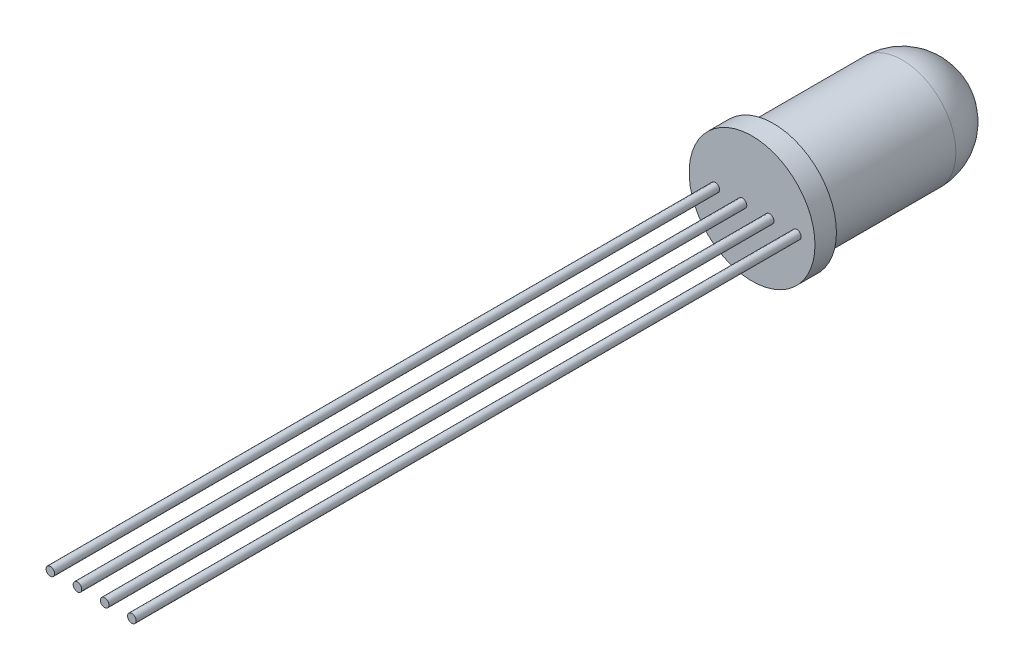
ISO-10303-21;
HEADER;
FILE_DESCRIPTION(('STEP AP214'),'2;1');
FILE_NAME('part.step','',(''),(''),'','','');
FILE_SCHEMA(('AUTOMOTIVE_DESIGN { 1 0 10303 214 1 1 1 1 }'));
ENDSEC;
DATA;
#1=APPLICATION_CONTEXT('core data for automotive mechanical design processes');
#2=APPLICATION_PROTOCOL_DEFINITION('international standard','automotive_design',2000,#1);
#3=PRODUCT_CONTEXT('',#1,'mechanical');
#4=PRODUCT('Part','Part','',(#3));
#5=PRODUCT_RELATED_PRODUCT_CATEGORY('part','',(#4));
#6=PRODUCT_DEFINITION_FORMATION('','',#4);
#7=PRODUCT_DEFINITION_CONTEXT('part definition',#1,'design');
#8=PRODUCT_DEFINITION('design','',#6,#7);
#9=PRODUCT_DEFINITION_SHAPE('','',#8);
#10=(LENGTH_UNIT() NAMED_UNIT(*) SI_UNIT(.MILLI.,.METRE.));
#11=(NAMED_UNIT(*) PLANE_ANGLE_UNIT() SI_UNIT($,.RADIAN.));
#12=(NAMED_UNIT(*) SI_UNIT($,.STERADIAN.) SOLID_ANGLE_UNIT());
#13=UNCERTAINTY_MEASURE_WITH_UNIT(LENGTH_MEASURE(1.E-05),#10,'distance_accuracy_value','');
#14=(GEOMETRIC_REPRESENTATION_CONTEXT(3) GLOBAL_UNCERTAINTY_ASSIGNED_CONTEXT((#13)) GLOBAL_UNIT_ASSIGNED_CONTEXT((#10,
#11,#12)) REPRESENTATION_CONTEXT('',''));
#15=CARTESIAN_POINT('',(0.,0.,0.));
#16=DIRECTION('',(0.,0.,1.));
#17=DIRECTION('',(1.,0.,0.));
#18=AXIS2_PLACEMENT_3D('',#15,#16,#17);
#19=CARTESIAN_POINT('',(0.,0.,8.5));
#20=DIRECTION('',(0.,0.,-1.));
#21=DIRECTION('',(-1.,0.,0.));
#22=AXIS2_PLACEMENT_3D('',#19,#20,#21);
#23=CYLINDRICAL_SURFACE('',#22,2.5);
#24=CARTESIAN_POINT('',(0.,0.,2.5));
#25=DIRECTION('',(0.,0.,-1.));
#26=DIRECTION('',(-1.,0.,0.));
#27=AXIS2_PLACEMENT_3D('',#24,#25,#26);
#28=CIRCLE('',#27,2.5);
#29=CARTESIAN_POINT('',(-2.5,0.,2.5));
#30=VERTEX_POINT('',#29);
#31=EDGE_CURVE('E10',#30,#30,#28,.F.);
#32=ORIENTED_EDGE('',*,*,#31,.T.);
#33=EDGE_LOOP('',(#32));
#34=FACE_BOUND('',#33,.T.);
#35=CARTESIAN_POINT('',(0.,0.,8.5));
#36=DIRECTION('',(0.,0.,1.));
#37=DIRECTION('',(1.,0.,0.));
#38=AXIS2_PLACEMENT_3D('',#35,#36,#37);
#39=CIRCLE('',#38,2.5);
#40=CARTESIAN_POINT('',(2.5,0.,8.5));
#41=VERTEX_POINT('',#40);
#42=EDGE_CURVE('E48',#41,#41,#39,.T.);
#43=ORIENTED_EDGE('',*,*,#42,.F.);
#44=EDGE_LOOP('',(#43));
#45=FACE_BOUND('',#44,.T.);
#46=ADVANCED_FACE('F41',(#34,#45),#23,.T.);
#47=CARTESIAN_POINT('',(0.,0.,9.5));
#48=DIRECTION('',(0.,0.,-1.));
#49=DIRECTION('',(-1.,0.,0.));
#50=AXIS2_PLACEMENT_3D('',#47,#48,#49);
#51=CYLINDRICAL_SURFACE('',#50,2.93297603406801);
#52=CARTESIAN_POINT('',(0.,0.,9.5));
#53=DIRECTION('',(0.,0.,1.));
#54=DIRECTION('',(1.,0.,0.));
#55=AXIS2_PLACEMENT_3D('',#52,#53,#54);
#56=CIRCLE('',#55,2.93297603406801);
#57=CARTESIAN_POINT('',(2.93297603406801,0.,9.5));
#58=VERTEX_POINT('',#57);
#59=EDGE_CURVE('E52',#58,#58,#56,.T.);
#60=ORIENTED_EDGE('',*,*,#59,.F.);
#61=EDGE_LOOP('',(#60));
#62=FACE_BOUND('',#61,.T.);
#63=CARTESIAN_POINT('',(0.,0.,8.5));
#64=DIRECTION('',(0.,0.,1.));
#65=DIRECTION('',(1.,0.,0.));
#66=AXIS2_PLACEMENT_3D('',#63,#64,#65);
#67=CIRCLE('',#66,2.93297603406801);
#68=CARTESIAN_POINT('',(2.93297603406801,0.,8.5));
#69=VERTEX_POINT('',#68);
#70=EDGE_CURVE('E56',#69,#69,#67,.T.);
#71=ORIENTED_EDGE('',*,*,#70,.T.);
#72=EDGE_LOOP('',(#71));
#73=FACE_BOUND('',#72,.T.);
#74=ADVANCED_FACE('F92',(#62,#73),#51,.T.);
#75=CARTESIAN_POINT('',(0.,0.,9.5));
#76=DIRECTION('',(0.,0.,1.));
#77=DIRECTION('',(1.,0.,0.));
#78=AXIS2_PLACEMENT_3D('',#75,#76,#77);
#79=PLANE('',#78);
#80=CARTESIAN_POINT('',(2.08645972002002,0.,9.5));
#81=DIRECTION('',(0.,0.,1.));
#82=DIRECTION('',(1.,0.,0.));
#83=AXIS2_PLACEMENT_3D('',#80,#81,#82);
#84=CIRCLE('',#83,0.2);
#85=CARTESIAN_POINT('',(2.28645972002002,0.,9.5));
#86=VERTEX_POINT('',#85);
#87=EDGE_CURVE('E77',#86,#86,#84,.T.);
#88=ORIENTED_EDGE('',*,*,#87,.F.);
#89=EDGE_LOOP('',(#88));
#90=FACE_BOUND('',#89,.T.);
#91=CARTESIAN_POINT('',(0.819799720020016,0.,9.5));
#92=DIRECTION('',(0.,0.,1.));
#93=DIRECTION('',(1.,0.,0.));
#94=AXIS2_PLACEMENT_3D('',#91,#92,#93);
#95=CIRCLE('',#94,0.2);
#96=CARTESIAN_POINT('',(1.01979972002002,0.,9.5));
#97=VERTEX_POINT('',#96);
#98=EDGE_CURVE('E71',#97,#97,#95,.T.);
#99=ORIENTED_EDGE('',*,*,#98,.F.);
#100=EDGE_LOOP('',(#99));
#101=FACE_BOUND('',#100,.T.);
#102=CARTESIAN_POINT('',(-0.446860279979984,0.,9.5));
#103=DIRECTION('',(0.,0.,1.));
#104=DIRECTION('',(1.,0.,0.));
#105=AXIS2_PLACEMENT_3D('',#102,#103,#104);
#106=CIRCLE('',#105,0.2);
#107=CARTESIAN_POINT('',(-0.246860279979984,0.,9.5));
#108=VERTEX_POINT('',#107);
#109=EDGE_CURVE('E65',#108,#108,#106,.T.);
#110=ORIENTED_EDGE('',*,*,#109,.F.);
#111=EDGE_LOOP('',(#110));
#112=FACE_BOUND('',#111,.T.);
#113=CARTESIAN_POINT('',(-1.71346027997998,0.,9.5));
#114=DIRECTION('',(0.,0.,1.));
#115=DIRECTION('',(1.,0.,0.));
#116=AXIS2_PLACEMENT_3D('',#113,#114,#115);
#117=CIRCLE('',#116,0.2);
#118=CARTESIAN_POINT('',(-1.51346027997998,0.,9.5));
#119=VERTEX_POINT('',#118);
#120=EDGE_CURVE('E62',#119,#119,#117,.T.);
#121=ORIENTED_EDGE('',*,*,#120,.F.);
#122=EDGE_LOOP('',(#121));
#123=FACE_BOUND('',#122,.T.);
#124=ORIENTED_EDGE('',*,*,#59,.T.);
#125=EDGE_LOOP('',(#124));
#126=FACE_BOUND('',#125,.T.);
#127=ADVANCED_FACE('F88',(#90,#101,#112,#123,#126),#79,.T.);
#128=CARTESIAN_POINT('',(0.,0.,8.5));
#129=DIRECTION('',(0.,0.,1.));
#130=DIRECTION('',(1.,0.,0.));
#131=AXIS2_PLACEMENT_3D('',#128,#129,#130);
#132=PLANE('',#131);
#133=ORIENTED_EDGE('',*,*,#42,.T.);
#134=EDGE_LOOP('',(#133));
#135=FACE_BOUND('',#134,.T.);
#136=ORIENTED_EDGE('',*,*,#70,.F.);
#137=EDGE_LOOP('',(#136));
#138=FACE_BOUND('',#137,.T.);
#139=ADVANCED_FACE('F91',(#135,#138),#132,.F.);
#140=CARTESIAN_POINT('',(0.,0.,2.5));
#141=DIRECTION('',(0.,0.,1.));
#142=DIRECTION('',(1.,0.,0.));
#143=AXIS2_PLACEMENT_3D('',#140,#141,#142);
#144=SPHERICAL_SURFACE('',#143,2.5);
#145=ORIENTED_EDGE('',*,*,#31,.F.);
#146=EDGE_LOOP('',(#145));
#147=FACE_BOUND('',#146,.T.);
#148=ADVANCED_FACE('F43',(#147),#144,.T.);
#149=CARTESIAN_POINT('',(-1.71346027997998,0.,40.5));
#150=DIRECTION('',(0.,0.,-1.));
#151=DIRECTION('',(-1.,0.,0.));
#152=AXIS2_PLACEMENT_3D('',#149,#150,#151);
#153=CYLINDRICAL_SURFACE('',#152,0.2);
#154=CARTESIAN_POINT('',(-1.71346027997998,0.,40.5));
#155=DIRECTION('',(0.,0.,1.));
#156=DIRECTION('',(1.,0.,0.));
#157=AXIS2_PLACEMENT_3D('',#154,#155,#156);
#158=CIRCLE('',#157,0.2);
#159=CARTESIAN_POINT('',(-1.51346027997998,0.,40.5));
#160=VERTEX_POINT('',#159);
#161=EDGE_CURVE('E60',#160,#160,#158,.T.);
#162=ORIENTED_EDGE('',*,*,#161,.F.);
#163=EDGE_LOOP('',(#162));
#164=FACE_BOUND('',#163,.T.);
#165=ORIENTED_EDGE('',*,*,#120,.T.);
#166=EDGE_LOOP('',(#165));
#167=FACE_BOUND('',#166,.T.);
#168=ADVANCED_FACE('F112',(#164,#167),#153,.T.);
#169=CARTESIAN_POINT('',(-1.71346027997998,0.,40.5));
#170=DIRECTION('',(0.,0.,1.));
#171=DIRECTION('',(1.,0.,0.));
#172=AXIS2_PLACEMENT_3D('',#169,#170,#171);
#173=PLANE('',#172);
#174=ORIENTED_EDGE('',*,*,#161,.T.);
#175=EDGE_LOOP('',(#174));
#176=FACE_BOUND('',#175,.T.);
#177=ADVANCED_FACE('F140',(#176),#173,.T.);
#178=CARTESIAN_POINT('',(-0.446860279979984,0.,40.5));
#179=DIRECTION('',(0.,0.,-1.));
#180=DIRECTION('',(-1.,0.,0.));
#181=AXIS2_PLACEMENT_3D('',#178,#179,#180);
#182=CYLINDRICAL_SURFACE('',#181,0.2);
#183=CARTESIAN_POINT('',(-0.446860279979984,0.,40.5));
#184=DIRECTION('',(0.,0.,1.));
#185=DIRECTION('',(1.,0.,0.));
#186=AXIS2_PLACEMENT_3D('',#183,#184,#185);
#187=CIRCLE('',#186,0.2);
#188=CARTESIAN_POINT('',(-0.246860279979984,0.,40.5));
#189=VERTEX_POINT('',#188);
#190=EDGE_CURVE('E68',#189,#189,#187,.T.);
#191=ORIENTED_EDGE('',*,*,#190,.F.);
#192=EDGE_LOOP('',(#191));
#193=FACE_BOUND('',#192,.T.);
#194=ORIENTED_EDGE('',*,*,#109,.T.);
#195=EDGE_LOOP('',(#194));
#196=FACE_BOUND('',#195,.T.);
#197=ADVANCED_FACE('F151',(#193,#196),#182,.T.);
#198=CARTESIAN_POINT('',(-0.446860279979984,0.,40.5));
#199=DIRECTION('',(0.,0.,1.));
#200=DIRECTION('',(1.,0.,0.));
#201=AXIS2_PLACEMENT_3D('',#198,#199,#200);
#202=PLANE('',#201);
#203=ORIENTED_EDGE('',*,*,#190,.T.);
#204=EDGE_LOOP('',(#203));
#205=FACE_BOUND('',#204,.T.);
#206=ADVANCED_FACE('F162',(#205),#202,.T.);
#207=CARTESIAN_POINT('',(0.819799720020016,0.,40.5));
#208=DIRECTION('',(0.,0.,-1.));
#209=DIRECTION('',(-1.,0.,0.));
#210=AXIS2_PLACEMENT_3D('',#207,#208,#209);
#211=CYLINDRICAL_SURFACE('',#210,0.2);
#212=CARTESIAN_POINT('',(0.819799720020016,0.,40.5));
#213=DIRECTION('',(0.,0.,1.));
#214=DIRECTION('',(1.,0.,0.));
#215=AXIS2_PLACEMENT_3D('',#212,#213,#214);
#216=CIRCLE('',#215,0.2);
#217=CARTESIAN_POINT('',(1.01979972002002,0.,40.5));
#218=VERTEX_POINT('',#217);
#219=EDGE_CURVE('E74',#218,#218,#216,.T.);
#220=ORIENTED_EDGE('',*,*,#219,.F.);
#221=EDGE_LOOP('',(#220));
#222=FACE_BOUND('',#221,.T.);
#223=ORIENTED_EDGE('',*,*,#98,.T.);
#224=EDGE_LOOP('',(#223));
#225=FACE_BOUND('',#224,.T.);
#226=ADVANCED_FACE('F173',(#222,#225),#211,.T.);
#227=CARTESIAN_POINT('',(0.819799720020016,0.,40.5));
#228=DIRECTION('',(0.,0.,1.));
#229=DIRECTION('',(1.,0.,0.));
#230=AXIS2_PLACEMENT_3D('',#227,#228,#229);
#231=PLANE('',#230);
#232=ORIENTED_EDGE('',*,*,#219,.T.);
#233=EDGE_LOOP('',(#232));
#234=FACE_BOUND('',#233,.T.);
#235=ADVANCED_FACE('F184',(#234),#231,.T.);
#236=CARTESIAN_POINT('',(2.08645972002002,0.,40.5));
#237=DIRECTION('',(0.,0.,-1.));
#238=DIRECTION('',(-1.,0.,0.));
#239=AXIS2_PLACEMENT_3D('',#236,#237,#238);
#240=CYLINDRICAL_SURFACE('',#239,0.2);
#241=CARTESIAN_POINT('',(2.08645972002002,0.,40.5));
#242=DIRECTION('',(0.,0.,1.));
#243=DIRECTION('',(1.,0.,0.));
#244=AXIS2_PLACEMENT_3D('',#241,#242,#243);
#245=CIRCLE('',#244,0.2);
#246=CARTESIAN_POINT('',(2.28645972002002,0.,40.5));
#247=VERTEX_POINT('',#246);
#248=EDGE_CURVE('E80',#247,#247,#245,.T.);
#249=ORIENTED_EDGE('',*,*,#248,.F.);
#250=EDGE_LOOP('',(#249));
#251=FACE_BOUND('',#250,.T.);
#252=ORIENTED_EDGE('',*,*,#87,.T.);
#253=EDGE_LOOP('',(#252));
#254=FACE_BOUND('',#253,.T.);
#255=ADVANCED_FACE('F86',(#251,#254),#240,.T.);
#256=CARTESIAN_POINT('',(2.08645972002002,0.,40.5));
#257=DIRECTION('',(0.,0.,1.));
#258=DIRECTION('',(1.,0.,0.));
#259=AXIS2_PLACEMENT_3D('',#256,#257,#258);
#260=PLANE('',#259);
#261=ORIENTED_EDGE('',*,*,#248,.T.);
#262=EDGE_LOOP('',(#261));
#263=FACE_BOUND('',#262,.T.);
#264=ADVANCED_FACE('F205',(#263),#260,.T.);
#265=CLOSED_SHELL('',(#46,#74,#127,#139,#148,#168,#177,#197,#206,#226,#235,#255,#264));
#266=MANIFOLD_SOLID_BREP('B2',#265);
#267=ADVANCED_BREP_SHAPE_REPRESENTATION('',(#18,#266),#14);
#268=SHAPE_DEFINITION_REPRESENTATION(#9,#267);
ENDSEC;
END-ISO-10303-21;
